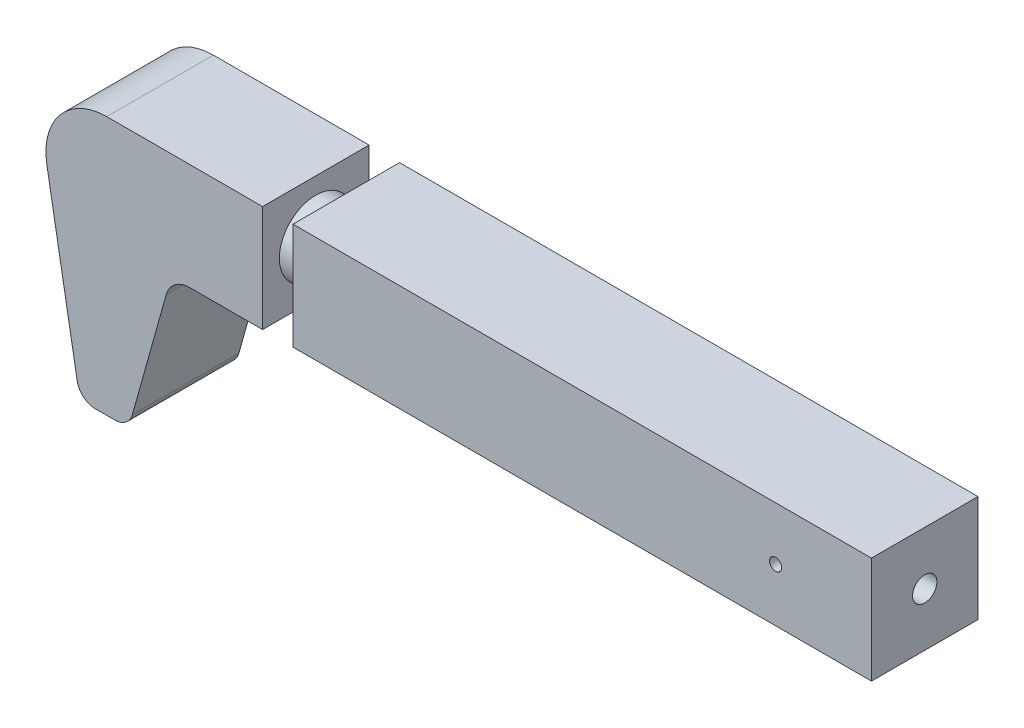
ISO-10303-21;
HEADER;
FILE_DESCRIPTION(('STEP AP214'),'2;1');
FILE_NAME('part.step','',(''),(''),'','','');
FILE_SCHEMA(('AUTOMOTIVE_DESIGN { 1 0 10303 214 1 1 1 1 }'));
ENDSEC;
DATA;
#1=APPLICATION_CONTEXT('core data for automotive mechanical design processes');
#2=APPLICATION_PROTOCOL_DEFINITION('international standard','automotive_design',2000,#1);
#3=PRODUCT_CONTEXT('',#1,'mechanical');
#4=PRODUCT('Part','Part','',(#3));
#5=PRODUCT_RELATED_PRODUCT_CATEGORY('part','',(#4));
#6=PRODUCT_DEFINITION_FORMATION('','',#4);
#7=PRODUCT_DEFINITION_CONTEXT('part definition',#1,'design');
#8=PRODUCT_DEFINITION('design','',#6,#7);
#9=PRODUCT_DEFINITION_SHAPE('','',#8);
#10=(LENGTH_UNIT() NAMED_UNIT(*) SI_UNIT(.MILLI.,.METRE.));
#11=(NAMED_UNIT(*) PLANE_ANGLE_UNIT() SI_UNIT($,.RADIAN.));
#12=(NAMED_UNIT(*) SI_UNIT($,.STERADIAN.) SOLID_ANGLE_UNIT());
#13=UNCERTAINTY_MEASURE_WITH_UNIT(LENGTH_MEASURE(1.E-05),#10,'distance_accuracy_value','');
#14=(GEOMETRIC_REPRESENTATION_CONTEXT(3) GLOBAL_UNCERTAINTY_ASSIGNED_CONTEXT((#13)) GLOBAL_UNIT_ASSIGNED_CONTEXT((#10,
#11,#12)) REPRESENTATION_CONTEXT('',''));
#15=CARTESIAN_POINT('',(0.,0.,0.));
#16=DIRECTION('',(0.,0.,1.));
#17=DIRECTION('',(1.,0.,0.));
#18=AXIS2_PLACEMENT_3D('',#15,#16,#17);
#19=CARTESIAN_POINT('',(100.,17.5,17.5));
#20=DIRECTION('',(0.,0.,-1.));
#21=DIRECTION('',(-1.,0.,0.));
#22=AXIS2_PLACEMENT_3D('',#19,#20,#21);
#23=PLANE('',#22);
#24=CARTESIAN_POINT('',(84.25,8.75000000000001,17.5));
#25=DIRECTION('',(0.,0.,-1.));
#26=DIRECTION('',(-1.,0.,0.));
#27=AXIS2_PLACEMENT_3D('',#24,#25,#26);
#28=CIRCLE('',#27,0.999999999999998);
#29=CARTESIAN_POINT('',(83.25,8.75000000000001,17.5));
#30=VERTEX_POINT('',#29);
#31=EDGE_CURVE('E190',#30,#30,#28,.T.);
#32=ORIENTED_EDGE('',*,*,#31,.T.);
#33=EDGE_LOOP('',(#32));
#34=FACE_BOUND('',#33,.T.);
#35=DIRECTION('',(0.,-1.,0.));
#36=VECTOR('',#35,1.);
#37=CARTESIAN_POINT('',(5.,17.5,17.5));
#38=LINE('',#37,#36);
#39=CARTESIAN_POINT('',(5.,17.5,17.5));
#40=VERTEX_POINT('',#39);
#41=CARTESIAN_POINT('',(5.,0.,17.5));
#42=VERTEX_POINT('',#41);
#43=EDGE_CURVE('E197',#40,#42,#38,.T.);
#44=ORIENTED_EDGE('',*,*,#43,.T.);
#45=DIRECTION('',(-1.,0.,0.));
#46=VECTOR('',#45,1.);
#47=CARTESIAN_POINT('',(100.,0.,17.5));
#48=LINE('',#47,#46);
#49=CARTESIAN_POINT('',(100.,0.,17.5));
#50=VERTEX_POINT('',#49);
#51=EDGE_CURVE('E49',#50,#42,#48,.T.);
#52=ORIENTED_EDGE('',*,*,#51,.F.);
#53=DIRECTION('',(0.,-1.,0.));
#54=VECTOR('',#53,1.);
#55=CARTESIAN_POINT('',(100.,17.5,17.5));
#56=LINE('',#55,#54);
#57=CARTESIAN_POINT('',(100.,17.5,17.5));
#58=VERTEX_POINT('',#57);
#59=EDGE_CURVE('E200',#58,#50,#56,.T.);
#60=ORIENTED_EDGE('',*,*,#59,.F.);
#61=DIRECTION('',(-1.,0.,0.));
#62=VECTOR('',#61,1.);
#63=CARTESIAN_POINT('',(100.,17.5,17.5));
#64=LINE('',#63,#62);
#65=EDGE_CURVE('E206',#58,#40,#64,.T.);
#66=ORIENTED_EDGE('',*,*,#65,.T.);
#67=EDGE_LOOP('',(#44,#52,#60,#66));
#68=FACE_BOUND('',#67,.T.);
#69=ADVANCED_FACE('F35',(#34,#68),#23,.F.);
#70=CARTESIAN_POINT('',(100.,0.,17.5));
#71=DIRECTION('',(0.,1.,0.));
#72=DIRECTION('',(0.,0.,1.));
#73=AXIS2_PLACEMENT_3D('',#70,#71,#72);
#74=PLANE('',#73);
#75=DIRECTION('',(0.,0.,-1.));
#76=VECTOR('',#75,1.);
#77=CARTESIAN_POINT('',(5.,0.,17.5));
#78=LINE('',#77,#76);
#79=CARTESIAN_POINT('',(5.,0.,0.));
#80=VERTEX_POINT('',#79);
#81=EDGE_CURVE('E209',#42,#80,#78,.T.);
#82=ORIENTED_EDGE('',*,*,#81,.T.);
#83=DIRECTION('',(-1.,0.,0.));
#84=VECTOR('',#83,1.);
#85=CARTESIAN_POINT('',(100.,0.,0.));
#86=LINE('',#85,#84);
#87=CARTESIAN_POINT('',(100.,0.,0.));
#88=VERTEX_POINT('',#87);
#89=EDGE_CURVE('E216',#88,#80,#86,.T.);
#90=ORIENTED_EDGE('',*,*,#89,.F.);
#91=DIRECTION('',(0.,0.,-1.));
#92=VECTOR('',#91,1.);
#93=CARTESIAN_POINT('',(100.,0.,17.5));
#94=LINE('',#93,#92);
#95=EDGE_CURVE('E90',#50,#88,#94,.T.);
#96=ORIENTED_EDGE('',*,*,#95,.F.);
#97=ORIENTED_EDGE('',*,*,#51,.T.);
#98=EDGE_LOOP('',(#82,#90,#96,#97));
#99=FACE_BOUND('',#98,.T.);
#100=ADVANCED_FACE('F246',(#99),#74,.F.);
#101=CARTESIAN_POINT('',(100.,17.5,0.));
#102=DIRECTION('',(0.,0.,1.));
#103=DIRECTION('',(1.,0.,0.));
#104=AXIS2_PLACEMENT_3D('',#101,#102,#103);
#105=PLANE('',#104);
#106=CARTESIAN_POINT('',(84.25,8.75000000000001,0.));
#107=DIRECTION('',(0.,0.,-1.));
#108=DIRECTION('',(-1.,0.,0.));
#109=AXIS2_PLACEMENT_3D('',#106,#107,#108);
#110=CIRCLE('',#109,0.999999999999998);
#111=CARTESIAN_POINT('',(83.25,8.75000000000001,0.));
#112=VERTEX_POINT('',#111);
#113=EDGE_CURVE('E181',#112,#112,#110,.T.);
#114=ORIENTED_EDGE('',*,*,#113,.F.);
#115=EDGE_LOOP('',(#114));
#116=FACE_BOUND('',#115,.T.);
#117=DIRECTION('',(0.,1.,0.));
#118=VECTOR('',#117,1.);
#119=CARTESIAN_POINT('',(5.,17.5,0.));
#120=LINE('',#119,#118);
#121=CARTESIAN_POINT('',(5.,17.5,0.));
#122=VERTEX_POINT('',#121);
#123=EDGE_CURVE('E76',#80,#122,#120,.T.);
#124=ORIENTED_EDGE('',*,*,#123,.T.);
#125=DIRECTION('',(-1.,0.,0.));
#126=VECTOR('',#125,1.);
#127=CARTESIAN_POINT('',(100.,17.5,0.));
#128=LINE('',#127,#126);
#129=CARTESIAN_POINT('',(100.,17.5,0.));
#130=VERTEX_POINT('',#129);
#131=EDGE_CURVE('E214',#130,#122,#128,.T.);
#132=ORIENTED_EDGE('',*,*,#131,.F.);
#133=DIRECTION('',(0.,1.,0.));
#134=VECTOR('',#133,1.);
#135=CARTESIAN_POINT('',(100.,17.5,0.));
#136=LINE('',#135,#134);
#137=EDGE_CURVE('E203',#88,#130,#136,.T.);
#138=ORIENTED_EDGE('',*,*,#137,.F.);
#139=ORIENTED_EDGE('',*,*,#89,.T.);
#140=EDGE_LOOP('',(#124,#132,#138,#139));
#141=FACE_BOUND('',#140,.T.);
#142=ADVANCED_FACE('F251',(#116,#141),#105,.F.);
#143=CARTESIAN_POINT('',(100.,17.5,17.5));
#144=DIRECTION('',(0.,-1.,0.));
#145=DIRECTION('',(0.,0.,-1.));
#146=AXIS2_PLACEMENT_3D('',#143,#144,#145);
#147=PLANE('',#146);
#148=DIRECTION('',(0.,0.,1.));
#149=VECTOR('',#148,1.);
#150=CARTESIAN_POINT('',(5.,17.5,17.5));
#151=LINE('',#150,#149);
#152=EDGE_CURVE('E82',#122,#40,#151,.T.);
#153=ORIENTED_EDGE('',*,*,#152,.T.);
#154=ORIENTED_EDGE('',*,*,#65,.F.);
#155=DIRECTION('',(0.,0.,1.));
#156=VECTOR('',#155,1.);
#157=CARTESIAN_POINT('',(100.,17.5,17.5));
#158=LINE('',#157,#156);
#159=EDGE_CURVE('E58',#130,#58,#158,.T.);
#160=ORIENTED_EDGE('',*,*,#159,.F.);
#161=ORIENTED_EDGE('',*,*,#131,.T.);
#162=EDGE_LOOP('',(#153,#154,#160,#161));
#163=FACE_BOUND('',#162,.T.);
#164=ADVANCED_FACE('F261',(#163),#147,.F.);
#165=CARTESIAN_POINT('',(100.,0.,0.));
#166=DIRECTION('',(1.,0.,0.));
#167=DIRECTION('',(0.,0.,-1.));
#168=AXIS2_PLACEMENT_3D('',#165,#166,#167);
#169=PLANE('',#168);
#170=CARTESIAN_POINT('',(100.,8.75,8.75));
#171=DIRECTION('',(1.,0.,0.));
#172=DIRECTION('',(0.,1.,0.));
#173=AXIS2_PLACEMENT_3D('',#170,#171,#172);
#174=CIRCLE('',#173,2.);
#175=CARTESIAN_POINT('',(100.,10.75,8.75));
#176=VERTEX_POINT('',#175);
#177=EDGE_CURVE('E193',#176,#176,#174,.T.);
#178=ORIENTED_EDGE('',*,*,#177,.F.);
#179=EDGE_LOOP('',(#178));
#180=FACE_BOUND('',#179,.T.);
#181=ORIENTED_EDGE('',*,*,#59,.T.);
#182=ORIENTED_EDGE('',*,*,#95,.T.);
#183=ORIENTED_EDGE('',*,*,#137,.T.);
#184=ORIENTED_EDGE('',*,*,#159,.T.);
#185=EDGE_LOOP('',(#181,#182,#183,#184));
#186=FACE_BOUND('',#185,.T.);
#187=ADVANCED_FACE('F259',(#180,#186),#169,.T.);
#188=CARTESIAN_POINT('',(5.,0.,0.));
#189=DIRECTION('',(1.,0.,0.));
#190=DIRECTION('',(0.,0.,-1.));
#191=AXIS2_PLACEMENT_3D('',#188,#189,#190);
#192=PLANE('',#191);
#193=CARTESIAN_POINT('',(5.,8.75,8.75));
#194=DIRECTION('',(-1.,0.,0.));
#195=DIRECTION('',(0.,0.,1.));
#196=AXIS2_PLACEMENT_3D('',#193,#194,#195);
#197=CIRCLE('',#196,6.);
#198=CARTESIAN_POINT('',(5.,8.75,14.75));
#199=VERTEX_POINT('',#198);
#200=EDGE_CURVE('E11',#199,#199,#197,.T.);
#201=ORIENTED_EDGE('',*,*,#200,.F.);
#202=EDGE_LOOP('',(#201));
#203=FACE_BOUND('',#202,.T.);
#204=ORIENTED_EDGE('',*,*,#43,.F.);
#205=ORIENTED_EDGE('',*,*,#152,.F.);
#206=ORIENTED_EDGE('',*,*,#123,.F.);
#207=ORIENTED_EDGE('',*,*,#81,.F.);
#208=EDGE_LOOP('',(#204,#205,#206,#207));
#209=FACE_BOUND('',#208,.T.);
#210=ADVANCED_FACE('F243',(#203,#209),#192,.F.);
#211=CARTESIAN_POINT('',(50.,8.74999999999999,8.75));
#212=DIRECTION('',(1.,0.,0.));
#213=DIRECTION('',(0.,1.,0.));
#214=AXIS2_PLACEMENT_3D('',#211,#212,#213);
#215=CYLINDRICAL_SURFACE('',#214,2.);
#216=CARTESIAN_POINT('',(83.25,8.75000000000001,10.75));
#217=CARTESIAN_POINT('',(83.2500033023195,8.69742803704703,10.7499971340415));
#218=CARTESIAN_POINT('',(83.2541700731217,8.64479340030198,10.7479049101952));
#219=CARTESIAN_POINT('',(83.2706528803409,8.54107976473159,10.739741560374));
#220=CARTESIAN_POINT('',(83.2829843929977,8.49000391328651,10.7336628782898));
#221=CARTESIAN_POINT('',(83.3151938086168,8.39106645511944,10.7181627940331));
#222=CARTESIAN_POINT('',(83.335042384248,8.34319319706083,10.7087543917752));
#223=CARTESIAN_POINT('',(83.3815706213649,8.25152738319345,10.6874577651578));
#224=CARTESIAN_POINT('',(83.4082497442489,8.20773450600996,10.6755697363353));
#225=CARTESIAN_POINT('',(83.4695172494853,8.12249218223809,10.6495625825806));
#226=CARTESIAN_POINT('',(83.5044864792396,8.0813447888779,10.6353519912754));
#227=CARTESIAN_POINT('',(83.5805214792471,8.00522055513303,10.6065997024675));
#228=CARTESIAN_POINT('',(83.6215918517725,7.97024841689325,10.5920577620904));
#229=CARTESIAN_POINT('',(83.7124833495234,7.90474799954973,10.5629895119735));
#230=CARTESIAN_POINT('',(83.7627360983459,7.87477466444837,10.5485518697013));
#231=CARTESIAN_POINT('',(83.8683673359862,7.82383177310932,10.5228597877232));
#232=CARTESIAN_POINT('',(83.9237421287228,7.80285578503368,10.5116030760699));
#233=CARTESIAN_POINT('',(84.0346651054219,7.77186755781142,10.4945786703781));
#234=CARTESIAN_POINT('',(84.0900044520674,7.76127414291957,10.4885227158371));
#235=CARTESIAN_POINT('',(84.2019788377795,7.74957300669117,10.4818188994853));
#236=CARTESIAN_POINT('',(84.2586125408712,7.74845591162694,10.4811656934329));
#237=CARTESIAN_POINT('',(84.3642860243154,7.75531271282772,10.4851093025725));
#238=CARTESIAN_POINT('',(84.4134240312231,7.7622154404632,10.4890876366201));
#239=CARTESIAN_POINT('',(84.509721909373,7.78306015094308,10.5007622873385));
#240=CARTESIAN_POINT('',(84.5568811453053,7.79700437610236,10.5084597883178));
#241=CARTESIAN_POINT('',(84.6492291325657,7.83179021961401,10.5268747641274));
#242=CARTESIAN_POINT('',(84.6943463987858,7.85278493288402,10.53765840664));
#243=CARTESIAN_POINT('',(84.78063429259,7.90095831233201,10.561034042814));
#244=CARTESIAN_POINT('',(84.8218031356001,7.92813975618755,10.5736268478019));
#245=CARTESIAN_POINT('',(84.9045212527432,7.99193394508723,10.6011315790329));
#246=CARTESIAN_POINT('',(84.9454568735762,8.02930554163073,10.6161351023675));
#247=CARTESIAN_POINT('',(85.0207354185909,8.11044442125864,10.6454762330041));
#248=CARTESIAN_POINT('',(85.0550751920339,8.15421474342574,10.659813519588));
#249=CARTESIAN_POINT('',(85.1176856610297,8.24948349416818,10.6870198728296));
#250=CARTESIAN_POINT('',(85.1456004724457,8.30124640840061,10.6997898416201));
#251=CARTESIAN_POINT('',(85.192097029043,8.40953378451122,10.7215788112124));
#252=CARTESIAN_POINT('',(85.2106861850152,8.46605442373474,10.7306007894355));
#253=CARTESIAN_POINT('',(85.2364754037167,8.57723350833932,10.7432433374144));
#254=CARTESIAN_POINT('',(85.2444912357468,8.63165846945169,10.7472493830131));
#255=CARTESIAN_POINT('',(85.2514647311345,8.74122040005066,10.750730134591));
#256=CARTESIAN_POINT('',(85.2504266856395,8.79635701986992,10.7502069872131));
#257=CARTESIAN_POINT('',(85.2397933115812,8.90123297198601,10.7449119225344));
#258=CARTESIAN_POINT('',(85.23086746727,8.95105940804997,10.7404724568819));
#259=CARTESIAN_POINT('',(85.2057619281049,9.04840689230193,10.7282217131482));
#260=CARTESIAN_POINT('',(85.1895814335466,9.09592768569101,10.7204100633433));
#261=CARTESIAN_POINT('',(85.1500015335668,9.18888860844968,10.7018425141367));
#262=CARTESIAN_POINT('',(85.1264089498832,9.23423039700616,10.6910088176994));
#263=CARTESIAN_POINT('',(85.072892464354,9.32046136169893,10.6674397431711));
#264=CARTESIAN_POINT('',(85.0429658654066,9.36134862977529,10.6547035556578));
#265=CARTESIAN_POINT('',(84.9742395746671,9.44176768929066,10.6270822133746));
#266=CARTESIAN_POINT('',(84.9348571315465,9.48077207782464,10.6121088484844));
#267=CARTESIAN_POINT('',(84.8500748487307,9.55185632111325,10.5826239160387));
#268=CARTESIAN_POINT('',(84.8046708811836,9.58393138569085,10.5681126738153));
#269=CARTESIAN_POINT('',(84.7063563457997,9.64170791449771,10.5405119222607));
#270=CARTESIAN_POINT('',(84.6531887337914,9.66702549587865,10.5275252966347));
#271=CARTESIAN_POINT('',(84.5424899323075,9.70808282601382,10.5057407236813));
#272=CARTESIAN_POINT('',(84.4849644734988,9.72383491588758,10.4969373824062));
#273=CARTESIAN_POINT('',(84.3730897771385,9.74386168744969,10.4856150100867));
#274=CARTESIAN_POINT('',(84.318965746571,9.74909299640088,10.4825738346049));
#275=CARTESIAN_POINT('',(84.2105529328293,9.7506891543808,10.4816535464617));
#276=CARTESIAN_POINT('',(84.1562642312606,9.74705784662441,10.4837721962755));
#277=CARTESIAN_POINT('',(84.054516498468,9.73192612559227,10.4923786205002));
#278=CARTESIAN_POINT('',(84.0068995298556,9.72120831434281,10.4984309448239));
#279=CARTESIAN_POINT('',(83.9141918805753,9.69317535822466,10.5137101618792));
#280=CARTESIAN_POINT('',(83.869102017908,9.67585809115982,10.5229380756968));
#281=CARTESIAN_POINT('',(83.7793751490134,9.63381574530069,10.5442853036453));
#282=CARTESIAN_POINT('',(83.7349720981703,9.60867113781647,10.5565572239619));
#283=CARTESIAN_POINT('',(83.6507254638194,9.55215097163664,10.5823533163459));
#284=CARTESIAN_POINT('',(83.6108842694815,9.52077217123865,10.5958781379452));
#285=CARTESIAN_POINT('',(83.5318580176424,9.44820332666464,10.6246232315931));
#286=CARTESIAN_POINT('',(83.4933408976381,9.40628442301017,10.6398498331147));
#287=CARTESIAN_POINT('',(83.4237370165764,9.31615480622029,10.6687775225509));
#288=CARTESIAN_POINT('',(83.3926542605737,9.2679407232568,10.6824777860804));
#289=CARTESIAN_POINT('',(83.3387636372378,9.16593159681996,10.706980095851));
#290=CARTESIAN_POINT('',(83.3160158305886,9.11209950393463,10.7177609656291));
#291=CARTESIAN_POINT('',(83.280191832081,9.0007421012942,10.7350134136347));
#292=CARTESIAN_POINT('',(83.2670881531704,8.94322779962318,10.7414972337293));
#293=CARTESIAN_POINT('',(83.2561025889242,8.86260194648339,10.7469546190966));
#294=CARTESIAN_POINT('',(83.2538173591364,8.84016187943951,10.748093653392));
#295=CARTESIAN_POINT('',(83.2507653344832,8.79515173180717,10.7496169697786));
#296=CARTESIAN_POINT('',(83.2499985815288,8.77258164764739,10.7500012310376));
#297=CARTESIAN_POINT('',(83.25,8.75000000000001,10.75));
#298=B_SPLINE_CURVE_WITH_KNOTS('',3,(#216,#217,#218,#219,#220,#221,#222,#223,#224,#225,#226,
#227,#228,#229,#230,#231,#232,#233,#234,#235,#236,#237,#238,#239,#240,#241,#242,#243,#244,#245,
#246,#247,#248,#249,#250,#251,#252,#253,#254,#255,#256,#257,#258,#259,#260,#261,#262,#263,#264,
#265,#266,#267,#268,#269,#270,#271,#272,#273,#274,#275,#276,#277,#278,#279,#280,#281,#282,#283,
#284,#285,#286,#287,#288,#289,#290,#291,#292,#293,#294,#295,#296,#297),.UNSPECIFIED.,.T.,.F.,(4,
2,2,2,2,2,2,2,2,2,2,2,2,2,2,2,2,2,2,2,2,2,2,2,2,2,2,2,2,2,2,2,2,2,2,2,2,2,2,2,4),(0.,
0.157624257420293,0.315548149709198,0.472862155492299,0.630163760581567,0.796981758718093,
0.963926237654037,1.14381726430753,1.32357947898281,1.49258012140231,1.66141357329021,
1.8100571240932,1.95874803925678,2.11090240168487,2.26312521260221,2.43464941333878,
2.60625534598687,2.7858302221444,2.96526216912279,3.12983290471345,3.29432564511475,
3.44606906506121,3.5978292163093,3.75392856027897,3.91009450748338,4.08159610644415,
4.25321588615431,4.43314682159674,4.61284511940778,4.77529307498375,4.93767059860005,
5.08457930244179,5.23153528783677,5.38836456775613,5.54527561138958,5.72125242752498,
5.89732383376571,6.07464013662924,6.25144908624929,6.31915280137696,6.38685838514845),.UNSPECIFIED.);
#299=CARTESIAN_POINT('',(83.25,8.75000000000001,10.75));
#300=VERTEX_POINT('',#299);
#301=EDGE_CURVE('E38',#300,#300,#298,.T.);
#302=ORIENTED_EDGE('',*,*,#301,.T.);
#303=EDGE_LOOP('',(#302));
#304=FACE_BOUND('',#303,.T.);
#305=CARTESIAN_POINT('',(83.25,8.75000000000001,6.75));
#306=CARTESIAN_POINT('',(83.2500033023195,8.802571962953,6.75000286595849));
#307=CARTESIAN_POINT('',(83.2541700731217,8.85520659969804,6.75209508980482));
#308=CARTESIAN_POINT('',(83.2706528803409,8.95892023526844,6.76025843962604));
#309=CARTESIAN_POINT('',(83.2829843929977,9.00999608671352,6.76633712171017));
#310=CARTESIAN_POINT('',(83.3151938086168,9.10893354488059,6.78183720596689));
#311=CARTESIAN_POINT('',(83.335042384248,9.15680680293919,6.7912456082248));
#312=CARTESIAN_POINT('',(83.3815706213649,9.24847261680658,6.81254223484222));
#313=CARTESIAN_POINT('',(83.4082497442489,9.29226549399007,6.82443026366471));
#314=CARTESIAN_POINT('',(83.4695172494853,9.37750781776194,6.85043741741944));
#315=CARTESIAN_POINT('',(83.5044864792396,9.41865521112213,6.86464800872465));
#316=CARTESIAN_POINT('',(83.5805214792471,9.49477944486699,6.89340029753256));
#317=CARTESIAN_POINT('',(83.6215918517725,9.52975158310678,6.90794223790966));
#318=CARTESIAN_POINT('',(83.7124833495234,9.59525200045029,6.93701048802654));
#319=CARTESIAN_POINT('',(83.7627360983459,9.62522533555165,6.95144813029869));
#320=CARTESIAN_POINT('',(83.8683673359862,9.67616822689071,6.9771402122768));
#321=CARTESIAN_POINT('',(83.9237421287228,9.69714421496635,6.98839692393011));
#322=CARTESIAN_POINT('',(84.0346651054219,9.7281324421886,7.00542132962192));
#323=CARTESIAN_POINT('',(84.0900044520674,9.73872585708045,7.01147728416287));
#324=CARTESIAN_POINT('',(84.2019788377795,9.75042699330886,7.01818110051473));
#325=CARTESIAN_POINT('',(84.2586125408712,9.75154408837308,7.01883430656713));
#326=CARTESIAN_POINT('',(84.3642860243154,9.7446872871723,7.01489069742752));
#327=CARTESIAN_POINT('',(84.4134240312231,9.73778455953683,7.01091236337987));
#328=CARTESIAN_POINT('',(84.509721909373,9.71693984905694,6.99923771266151));
#329=CARTESIAN_POINT('',(84.5568811453053,9.70299562389767,6.99154021168225));
#330=CARTESIAN_POINT('',(84.6492291325657,9.66820978038602,6.9731252358726));
#331=CARTESIAN_POINT('',(84.6943463987858,9.64721506711601,6.96234159336002));
#332=CARTESIAN_POINT('',(84.78063429259,9.59904168766801,6.93896595718597));
#333=CARTESIAN_POINT('',(84.8218031356001,9.57186024381248,6.9263731521981));
#334=CARTESIAN_POINT('',(84.9045212527432,9.5080660549128,6.89886842096715));
#335=CARTESIAN_POINT('',(84.9454568735762,9.47069445836929,6.88386489763254));
#336=CARTESIAN_POINT('',(85.0207354185909,9.38955557874137,6.85452376699593));
#337=CARTESIAN_POINT('',(85.0550751920339,9.34578525657429,6.84018648041199));
#338=CARTESIAN_POINT('',(85.1176856610297,9.25051650583186,6.81298012717037));
#339=CARTESIAN_POINT('',(85.1456004724457,9.19875359159942,6.80021015837993));
#340=CARTESIAN_POINT('',(85.192097029043,9.09046621548881,6.77842118878758));
#341=CARTESIAN_POINT('',(85.2106861850152,9.03394557626528,6.76939921056448));
#342=CARTESIAN_POINT('',(85.2364754037167,8.92276649166071,6.75675666258564));
#343=CARTESIAN_POINT('',(85.2444912357468,8.86834153054833,6.75275061698688));
#344=CARTESIAN_POINT('',(85.2514647311345,8.75877959994936,6.74926986540898));
#345=CARTESIAN_POINT('',(85.2504266856395,8.70364298013011,6.74979301278688));
#346=CARTESIAN_POINT('',(85.2397933115812,8.59876702801402,6.75508807746559));
#347=CARTESIAN_POINT('',(85.23086746727,8.54894059195006,6.7595275431181));
#348=CARTESIAN_POINT('',(85.2057619281049,8.45159310769809,6.77177828685181));
#349=CARTESIAN_POINT('',(85.1895814335467,8.40407231430901,6.77958993665667));
#350=CARTESIAN_POINT('',(85.1500015335668,8.31111139155035,6.7981574858633));
#351=CARTESIAN_POINT('',(85.1264089498832,8.26576960299386,6.8089911823006));
#352=CARTESIAN_POINT('',(85.072892464354,8.17953863830109,6.83256025682891));
#353=CARTESIAN_POINT('',(85.0429658654066,8.13865137022473,6.84529644434215));
#354=CARTESIAN_POINT('',(84.9742395746671,8.05823231070936,6.87291778662535));
#355=CARTESIAN_POINT('',(84.9348571315464,8.01922792217538,6.88789115151558));
#356=CARTESIAN_POINT('',(84.8500748487307,7.94814367888678,6.91737608396125));
#357=CARTESIAN_POINT('',(84.8046708811836,7.91606861430917,6.93188732618473));
#358=CARTESIAN_POINT('',(84.7063563457997,7.85829208550232,6.95948807773931));
#359=CARTESIAN_POINT('',(84.6531887337914,7.83297450412138,6.97247470336527));
#360=CARTESIAN_POINT('',(84.5424899323075,7.79191717398621,6.99425927631873));
#361=CARTESIAN_POINT('',(84.4849644734988,7.77616508411245,7.00306261759381));
#362=CARTESIAN_POINT('',(84.3730897771386,7.75613831255034,7.01438498991332));
#363=CARTESIAN_POINT('',(84.318965746571,7.75090700359915,7.01742616539508));
#364=CARTESIAN_POINT('',(84.2105529328293,7.74931084561923,7.01834645353824));
#365=CARTESIAN_POINT('',(84.1562642312606,7.75294215337562,7.01622780372447));
#366=CARTESIAN_POINT('',(84.054516498468,7.76807387440775,7.00762137949974));
#367=CARTESIAN_POINT('',(84.0068995298556,7.77879168565721,7.00156905517606));
#368=CARTESIAN_POINT('',(83.9141918805753,7.80682464177537,6.98628983812082));
#369=CARTESIAN_POINT('',(83.869102017908,7.8241419088402,6.97706192430324));
#370=CARTESIAN_POINT('',(83.7793751490134,7.86618425469934,6.95571469635471));
#371=CARTESIAN_POINT('',(83.7349720981703,7.89132886218357,6.94344277603808));
#372=CARTESIAN_POINT('',(83.6507254638194,7.94784902836339,6.91764668365409));
#373=CARTESIAN_POINT('',(83.6108842694815,7.97922782876138,6.90412186205477));
#374=CARTESIAN_POINT('',(83.5318580176424,8.05179667333538,6.87537676840686));
#375=CARTESIAN_POINT('',(83.4933408976381,8.09371557698985,6.86015016688531));
#376=CARTESIAN_POINT('',(83.4237370165764,8.18384519377974,6.83122247744912));
#377=CARTESIAN_POINT('',(83.3926542605737,8.23205927674323,6.8175222139196));
#378=CARTESIAN_POINT('',(83.3387636372378,8.33406840318007,6.79301990414897));
#379=CARTESIAN_POINT('',(83.3160158305886,8.3879004960654,6.78223903437091));
#380=CARTESIAN_POINT('',(83.280191832081,8.49925789870582,6.76498658636534));
#381=CARTESIAN_POINT('',(83.2670881531704,8.55677220037685,6.75850276627068));
#382=CARTESIAN_POINT('',(83.2561025889242,8.63739805351663,6.75304538090337));
#383=CARTESIAN_POINT('',(83.2538173591364,8.65983812056052,6.75190634660798));
#384=CARTESIAN_POINT('',(83.2507653344832,8.70484826819286,6.75038303022135));
#385=CARTESIAN_POINT('',(83.2499985815288,8.72741835235263,6.74999876896237));
#386=CARTESIAN_POINT('',(83.25,8.75000000000001,6.75));
#387=B_SPLINE_CURVE_WITH_KNOTS('',3,(#305,#306,#307,#308,#309,#310,#311,#312,#313,#314,#315,
#316,#317,#318,#319,#320,#321,#322,#323,#324,#325,#326,#327,#328,#329,#330,#331,#332,#333,#334,
#335,#336,#337,#338,#339,#340,#341,#342,#343,#344,#345,#346,#347,#348,#349,#350,#351,#352,#353,
#354,#355,#356,#357,#358,#359,#360,#361,#362,#363,#364,#365,#366,#367,#368,#369,#370,#371,#372,
#373,#374,#375,#376,#377,#378,#379,#380,#381,#382,#383,#384,#385,#386),.UNSPECIFIED.,.T.,.F.,(4,
2,2,2,2,2,2,2,2,2,2,2,2,2,2,2,2,2,2,2,2,2,2,2,2,2,2,2,2,2,2,2,2,2,2,2,2,2,2,2,4),(0.,
0.157624257420293,0.315548149709198,0.4728621554923,0.630163760581568,0.796981758718095,
0.963926237654039,1.14381726430754,1.32357947898281,1.4925801214023,1.66141357329021,
1.8100571240932,1.95874803925678,2.11090240168487,2.26312521260222,2.4346494133388,
2.60625534598686,2.7858302221444,2.9652621691228,3.12983290471346,3.29432564511476,
3.44606906506121,3.59782921630931,3.75392856027899,3.91009450748338,4.08159610644418,
4.25321588615431,4.43314682159673,4.61284511940776,4.77529307498373,4.93767059860004,
5.08457930244179,5.23153528783677,5.38836456775616,5.54527561138958,5.72125242752497,
5.89732383376571,6.07464013662924,6.25144908624929,6.31915280137696,6.38685838514845),.UNSPECIFIED.);
#388=CARTESIAN_POINT('',(83.25,8.75000000000001,6.75));
#389=VERTEX_POINT('',#388);
#390=EDGE_CURVE('E189',#389,#389,#387,.T.);
#391=ORIENTED_EDGE('',*,*,#390,.T.);
#392=EDGE_LOOP('',(#391));
#393=FACE_BOUND('',#392,.T.);
#394=CARTESIAN_POINT('',(50.,8.74999999999999,8.75));
#395=DIRECTION('',(1.,0.,0.));
#396=DIRECTION('',(0.,1.,0.));
#397=AXIS2_PLACEMENT_3D('',#394,#395,#396);
#398=CIRCLE('',#397,2.);
#399=CARTESIAN_POINT('',(50.,10.75,8.75));
#400=VERTEX_POINT('',#399);
#401=EDGE_CURVE('E194',#400,#400,#398,.T.);
#402=ORIENTED_EDGE('',*,*,#401,.F.);
#403=EDGE_LOOP('',(#402));
#404=FACE_BOUND('',#403,.T.);
#405=ORIENTED_EDGE('',*,*,#177,.T.);
#406=EDGE_LOOP('',(#405));
#407=FACE_BOUND('',#406,.T.);
#408=ADVANCED_FACE('F222',(#304,#393,#404,#407),#215,.F.);
#409=CARTESIAN_POINT('',(50.,8.74999999999999,8.75));
#410=DIRECTION('',(1.,0.,0.));
#411=DIRECTION('',(0.,1.,0.));
#412=AXIS2_PLACEMENT_3D('',#409,#410,#411);
#413=PLANE('',#412);
#414=ORIENTED_EDGE('',*,*,#401,.T.);
#415=EDGE_LOOP('',(#414));
#416=FACE_BOUND('',#415,.T.);
#417=ADVANCED_FACE('F234',(#416),#413,.T.);
#418=CARTESIAN_POINT('',(84.25,8.75000000000001,50.));
#419=DIRECTION('',(0.,0.,-1.));
#420=DIRECTION('',(-1.,0.,0.));
#421=AXIS2_PLACEMENT_3D('',#418,#419,#420);
#422=CYLINDRICAL_SURFACE('',#421,0.999999999999998);
#423=ORIENTED_EDGE('',*,*,#113,.T.);
#424=EDGE_LOOP('',(#423));
#425=FACE_BOUND('',#424,.T.);
#426=ORIENTED_EDGE('',*,*,#390,.F.);
#427=EDGE_LOOP('',(#426));
#428=FACE_BOUND('',#427,.T.);
#429=ADVANCED_FACE('F231',(#425,#428),#422,.F.);
#430=ORIENTED_EDGE('',*,*,#301,.F.);
#431=EDGE_LOOP('',(#430));
#432=FACE_BOUND('',#431,.T.);
#433=ORIENTED_EDGE('',*,*,#31,.F.);
#434=EDGE_LOOP('',(#433));
#435=FACE_BOUND('',#434,.T.);
#436=ADVANCED_FACE('F226',(#432,#435),#422,.F.);
#437=CARTESIAN_POINT('',(0.,8.75,8.75));
#438=DIRECTION('',(1.,0.,0.));
#439=DIRECTION('',(0.,0.,-1.));
#440=AXIS2_PLACEMENT_3D('',#437,#438,#439);
#441=CYLINDRICAL_SURFACE('',#440,6.);
#442=CARTESIAN_POINT('',(0.,8.75,8.75));
#443=DIRECTION('',(-1.,0.,0.));
#444=DIRECTION('',(0.,0.,1.));
#445=AXIS2_PLACEMENT_3D('',#442,#443,#444);
#446=CIRCLE('',#445,6.);
#447=CARTESIAN_POINT('',(0.,8.75,14.75));
#448=VERTEX_POINT('',#447);
#449=EDGE_CURVE('E178',#448,#448,#446,.T.);
#450=ORIENTED_EDGE('',*,*,#449,.F.);
#451=EDGE_LOOP('',(#450));
#452=FACE_BOUND('',#451,.T.);
#453=ORIENTED_EDGE('',*,*,#200,.T.);
#454=EDGE_LOOP('',(#453));
#455=FACE_BOUND('',#454,.T.);
#456=ADVANCED_FACE('F230',(#452,#455),#441,.T.);
#457=CARTESIAN_POINT('',(0.,17.5,17.5));
#458=DIRECTION('',(-1.,0.,0.));
#459=DIRECTION('',(0.,-1.,0.));
#460=AXIS2_PLACEMENT_3D('',#457,#458,#459);
#461=PLANE('',#460);
#462=ORIENTED_EDGE('',*,*,#449,.T.);
#463=EDGE_LOOP('',(#462));
#464=FACE_BOUND('',#463,.T.);
#465=DIRECTION('',(0.,1.,0.));
#466=VECTOR('',#465,1.);
#467=CARTESIAN_POINT('',(0.,17.5,0.));
#468=LINE('',#467,#466);
#469=CARTESIAN_POINT('',(0.,0.,0.));
#470=VERTEX_POINT('',#469);
#471=CARTESIAN_POINT('',(0.,17.5,0.));
#472=VERTEX_POINT('',#471);
#473=EDGE_CURVE('E177',#470,#472,#468,.T.);
#474=ORIENTED_EDGE('',*,*,#473,.T.);
#475=DIRECTION('',(0.,0.,-1.));
#476=VECTOR('',#475,1.);
#477=CARTESIAN_POINT('',(0.,17.5,17.5));
#478=LINE('',#477,#476);
#479=CARTESIAN_POINT('',(0.,17.5,17.5));
#480=VERTEX_POINT('',#479);
#481=EDGE_CURVE('E157',#480,#472,#478,.T.);
#482=ORIENTED_EDGE('',*,*,#481,.F.);
#483=DIRECTION('',(0.,1.,0.));
#484=VECTOR('',#483,1.);
#485=CARTESIAN_POINT('',(0.,17.5,17.5));
#486=LINE('',#485,#484);
#487=CARTESIAN_POINT('',(0.,0.,17.5));
#488=VERTEX_POINT('',#487);
#489=EDGE_CURVE('E164',#488,#480,#486,.T.);
#490=ORIENTED_EDGE('',*,*,#489,.F.);
#491=DIRECTION('',(0.,0.,-1.));
#492=VECTOR('',#491,1.);
#493=CARTESIAN_POINT('',(0.,0.,17.5));
#494=LINE('',#493,#492);
#495=EDGE_CURVE('E475',#488,#470,#494,.T.);
#496=ORIENTED_EDGE('',*,*,#495,.T.);
#497=EDGE_LOOP('',(#474,#482,#490,#496));
#498=FACE_BOUND('',#497,.T.);
#499=ADVANCED_FACE('F175',(#464,#498),#461,.F.);
#500=CARTESIAN_POINT('',(0.,17.5,17.5));
#501=DIRECTION('',(0.,-1.,0.));
#502=DIRECTION('',(1.,0.,0.));
#503=AXIS2_PLACEMENT_3D('',#500,#501,#502);
#504=PLANE('',#503);
#505=DIRECTION('',(-1.,0.,0.));
#506=VECTOR('',#505,1.);
#507=CARTESIAN_POINT('',(0.,17.5,0.));
#508=LINE('',#507,#506);
#509=CARTESIAN_POINT('',(-25.5824640740579,17.5,0.));
#510=VERTEX_POINT('',#509);
#511=EDGE_CURVE('E454',#472,#510,#508,.T.);
#512=ORIENTED_EDGE('',*,*,#511,.T.);
#513=DIRECTION('',(0.,0.,-1.));
#514=VECTOR('',#513,1.);
#515=CARTESIAN_POINT('',(-25.5824640740579,17.5,17.5));
#516=LINE('',#515,#514);
#517=CARTESIAN_POINT('',(-25.5824640740579,17.5,17.5));
#518=VERTEX_POINT('',#517);
#519=EDGE_CURVE('E160',#518,#510,#516,.T.);
#520=ORIENTED_EDGE('',*,*,#519,.F.);
#521=DIRECTION('',(-1.,0.,0.));
#522=VECTOR('',#521,1.);
#523=CARTESIAN_POINT('',(0.,17.5,17.5));
#524=LINE('',#523,#522);
#525=EDGE_CURVE('E153',#480,#518,#524,.T.);
#526=ORIENTED_EDGE('',*,*,#525,.F.);
#527=ORIENTED_EDGE('',*,*,#481,.T.);
#528=EDGE_LOOP('',(#512,#520,#526,#527));
#529=FACE_BOUND('',#528,.T.);
#530=ADVANCED_FACE('F155',(#529),#504,.F.);
#531=CARTESIAN_POINT('',(-25.5824640740579,7.5,17.5));
#532=DIRECTION('',(0.,0.,-1.));
#533=DIRECTION('',(-1.,0.,0.));
#534=AXIS2_PLACEMENT_3D('',#531,#532,#533);
#535=CYLINDRICAL_SURFACE('',#534,10.);
#536=CARTESIAN_POINT('',(-25.5824640740579,7.5,0.));
#537=DIRECTION('',(0.,0.,1.));
#538=DIRECTION('',(-1.,0.,0.));
#539=AXIS2_PLACEMENT_3D('',#536,#537,#538);
#540=CIRCLE('',#539,10.);
#541=CARTESIAN_POINT('',(-35.43054160418,5.76351822333072,0.));
#542=VERTEX_POINT('',#541);
#543=EDGE_CURVE('E456',#510,#542,#540,.T.);
#544=ORIENTED_EDGE('',*,*,#543,.T.);
#545=DIRECTION('',(0.,0.,-1.));
#546=VECTOR('',#545,1.);
#547=CARTESIAN_POINT('',(-35.43054160418,5.76351822333072,17.5));
#548=LINE('',#547,#546);
#549=CARTESIAN_POINT('',(-35.43054160418,5.76351822333072,17.5));
#550=VERTEX_POINT('',#549);
#551=EDGE_CURVE('E183',#550,#542,#548,.T.);
#552=ORIENTED_EDGE('',*,*,#551,.F.);
#553=CARTESIAN_POINT('',(-25.5824640740579,7.5,17.5));
#554=DIRECTION('',(0.,0.,1.));
#555=DIRECTION('',(-1.,0.,0.));
#556=AXIS2_PLACEMENT_3D('',#553,#554,#555);
#557=CIRCLE('',#556,10.);
#558=EDGE_CURVE('E163',#518,#550,#557,.T.);
#559=ORIENTED_EDGE('',*,*,#558,.F.);
#560=ORIENTED_EDGE('',*,*,#519,.T.);
#561=EDGE_LOOP('',(#544,#552,#559,#560));
#562=FACE_BOUND('',#561,.T.);
#563=ADVANCED_FACE('F347',(#562),#535,.T.);
#564=CARTESIAN_POINT('',(-30.4432276853951,-22.5209445330008,17.5));
#565=DIRECTION('',(0.984807753012208,0.173648177666928,0.));
#566=DIRECTION('',(-0.173648177666928,0.984807753012209,0.));
#567=AXIS2_PLACEMENT_3D('',#564,#565,#566);
#568=PLANE('',#567);
#569=DIRECTION('',(0.173648177666928,-0.984807753012208,0.));
#570=VECTOR('',#569,1.);
#571=CARTESIAN_POINT('',(-30.4432276853951,-22.5209445330008,0.));
#572=LINE('',#571,#570);
#573=CARTESIAN_POINT('',(-30.4432276853951,-22.5209445330008,0.));
#574=VERTEX_POINT('',#573);
#575=EDGE_CURVE('E462',#542,#574,#572,.T.);
#576=ORIENTED_EDGE('',*,*,#575,.T.);
#577=DIRECTION('',(0.,0.,-1.));
#578=VECTOR('',#577,1.);
#579=CARTESIAN_POINT('',(-30.4432276853951,-22.5209445330008,17.5));
#580=LINE('',#579,#578);
#581=CARTESIAN_POINT('',(-30.4432276853951,-22.5209445330008,17.5));
#582=VERTEX_POINT('',#581);
#583=EDGE_CURVE('E492',#582,#574,#580,.T.);
#584=ORIENTED_EDGE('',*,*,#583,.F.);
#585=DIRECTION('',(0.173648177666928,-0.984807753012208,0.));
#586=VECTOR('',#585,1.);
#587=CARTESIAN_POINT('',(-30.4432276853951,-22.5209445330008,17.5));
#588=LINE('',#587,#586);
#589=EDGE_CURVE('E499',#550,#582,#588,.T.);
#590=ORIENTED_EDGE('',*,*,#589,.F.);
#591=ORIENTED_EDGE('',*,*,#551,.T.);
#592=EDGE_LOOP('',(#576,#584,#590,#591));
#593=FACE_BOUND('',#592,.T.);
#594=ADVANCED_FACE('F355',(#593),#568,.F.);
#595=CARTESIAN_POINT('',(-27.4888044263585,-22.,17.5));
#596=DIRECTION('',(0.,0.,-1.));
#597=DIRECTION('',(-1.,0.,0.));
#598=AXIS2_PLACEMENT_3D('',#595,#596,#597);
#599=CYLINDRICAL_SURFACE('',#598,3.);
#600=CARTESIAN_POINT('',(-27.4888044263585,-22.,0.));
#601=DIRECTION('',(0.,0.,1.));
#602=DIRECTION('',(1.,0.,0.));
#603=AXIS2_PLACEMENT_3D('',#600,#601,#602);
#604=CIRCLE('',#603,3.);
#605=CARTESIAN_POINT('',(-27.4888044263585,-25.,0.));
#606=VERTEX_POINT('',#605);
#607=EDGE_CURVE('E464',#574,#606,#604,.T.);
#608=ORIENTED_EDGE('',*,*,#607,.T.);
#609=DIRECTION('',(0.,0.,-1.));
#610=VECTOR('',#609,1.);
#611=CARTESIAN_POINT('',(-27.4888044263585,-25.,17.5));
#612=LINE('',#611,#610);
#613=CARTESIAN_POINT('',(-27.4888044263585,-25.,17.5));
#614=VERTEX_POINT('',#613);
#615=EDGE_CURVE('E489',#614,#606,#612,.T.);
#616=ORIENTED_EDGE('',*,*,#615,.F.);
#617=CARTESIAN_POINT('',(-27.4888044263585,-22.,17.5));
#618=DIRECTION('',(0.,0.,1.));
#619=DIRECTION('',(1.,0.,0.));
#620=AXIS2_PLACEMENT_3D('',#617,#618,#619);
#621=CIRCLE('',#620,3.);
#622=EDGE_CURVE('E510',#582,#614,#621,.T.);
#623=ORIENTED_EDGE('',*,*,#622,.F.);
#624=ORIENTED_EDGE('',*,*,#583,.T.);
#625=EDGE_LOOP('',(#608,#616,#623,#624));
#626=FACE_BOUND('',#625,.T.);
#627=ADVANCED_FACE('F364',(#626),#599,.T.);
#628=CARTESIAN_POINT('',(-24.2809496744317,-25.,17.5));
#629=DIRECTION('',(0.,1.,0.));
#630=DIRECTION('',(0.,0.,1.));
#631=AXIS2_PLACEMENT_3D('',#628,#629,#630);
#632=PLANE('',#631);
#633=DIRECTION('',(1.,0.,0.));
#634=VECTOR('',#633,1.);
#635=CARTESIAN_POINT('',(-24.2809496744317,-25.,0.));
#636=LINE('',#635,#634);
#637=CARTESIAN_POINT('',(-24.2809496744317,-25.,0.));
#638=VERTEX_POINT('',#637);
#639=EDGE_CURVE('E466',#606,#638,#636,.T.);
#640=ORIENTED_EDGE('',*,*,#639,.T.);
#641=DIRECTION('',(0.,0.,-1.));
#642=VECTOR('',#641,1.);
#643=CARTESIAN_POINT('',(-24.2809496744317,-25.,17.5));
#644=LINE('',#643,#642);
#645=CARTESIAN_POINT('',(-24.2809496744317,-25.,17.5));
#646=VERTEX_POINT('',#645);
#647=EDGE_CURVE('E486',#646,#638,#644,.T.);
#648=ORIENTED_EDGE('',*,*,#647,.F.);
#649=DIRECTION('',(1.,0.,0.));
#650=VECTOR('',#649,1.);
#651=CARTESIAN_POINT('',(-24.2809496744317,-25.,17.5));
#652=LINE('',#651,#650);
#653=EDGE_CURVE('E507',#614,#646,#652,.T.);
#654=ORIENTED_EDGE('',*,*,#653,.F.);
#655=ORIENTED_EDGE('',*,*,#615,.T.);
#656=EDGE_LOOP('',(#640,#648,#654,#655));
#657=FACE_BOUND('',#656,.T.);
#658=ADVANCED_FACE('F373',(#657),#632,.F.);
#659=CARTESIAN_POINT('',(-24.2809496744317,-22.,17.5));
#660=DIRECTION('',(0.,0.,-1.));
#661=DIRECTION('',(-1.,0.,0.));
#662=AXIS2_PLACEMENT_3D('',#659,#660,#661);
#663=CYLINDRICAL_SURFACE('',#662,3.);
#664=CARTESIAN_POINT('',(-24.2809496744317,-22.,0.));
#665=DIRECTION('',(0.,0.,1.));
#666=DIRECTION('',(1.,0.,0.));
#667=AXIS2_PLACEMENT_3D('',#664,#665,#666);
#668=CIRCLE('',#667,3.);
#669=CARTESIAN_POINT('',(-21.3922407976166,-22.809543714082,0.));
#670=VERTEX_POINT('',#669);
#671=EDGE_CURVE('E468',#638,#670,#668,.T.);
#672=ORIENTED_EDGE('',*,*,#671,.T.);
#673=DIRECTION('',(0.,0.,-1.));
#674=VECTOR('',#673,1.);
#675=CARTESIAN_POINT('',(-21.3922407976166,-22.809543714082,17.5));
#676=LINE('',#675,#674);
#677=CARTESIAN_POINT('',(-21.3922407976166,-22.809543714082,17.5));
#678=VERTEX_POINT('',#677);
#679=EDGE_CURVE('E483',#678,#670,#676,.T.);
#680=ORIENTED_EDGE('',*,*,#679,.F.);
#681=CARTESIAN_POINT('',(-24.2809496744317,-22.,17.5));
#682=DIRECTION('',(0.,0.,1.));
#683=DIRECTION('',(1.,0.,0.));
#684=AXIS2_PLACEMENT_3D('',#681,#682,#683);
#685=CIRCLE('',#684,3.);
#686=EDGE_CURVE('E509',#646,#678,#685,.T.);
#687=ORIENTED_EDGE('',*,*,#686,.F.);
#688=ORIENTED_EDGE('',*,*,#647,.T.);
#689=EDGE_LOOP('',(#672,#680,#687,#688));
#690=FACE_BOUND('',#689,.T.);
#691=ADVANCED_FACE('F382',(#690),#663,.T.);
#692=CARTESIAN_POINT('',(-15.8184833630317,-2.92060838122396,17.5));
#693=DIRECTION('',(-0.962902958938361,0.269847904694012,0.));
#694=DIRECTION('',(-0.269847904694012,-0.962902958938361,0.));
#695=AXIS2_PLACEMENT_3D('',#692,#693,#694);
#696=PLANE('',#695);
#697=DIRECTION('',(0.269847904694012,0.962902958938361,0.));
#698=VECTOR('',#697,1.);
#699=CARTESIAN_POINT('',(-15.8184833630317,-2.92060838122396,0.));
#700=LINE('',#699,#698);
#701=CARTESIAN_POINT('',(-15.8184833630317,-2.92060838122396,0.));
#702=VERTEX_POINT('',#701);
#703=EDGE_CURVE('E470',#670,#702,#700,.T.);
#704=ORIENTED_EDGE('',*,*,#703,.T.);
#705=DIRECTION('',(0.,0.,-1.));
#706=VECTOR('',#705,1.);
#707=CARTESIAN_POINT('',(-15.8184833630317,-2.92060838122396,17.5));
#708=LINE('',#707,#706);
#709=CARTESIAN_POINT('',(-15.8184833630317,-2.92060838122396,17.5));
#710=VERTEX_POINT('',#709);
#711=EDGE_CURVE('E480',#710,#702,#708,.T.);
#712=ORIENTED_EDGE('',*,*,#711,.F.);
#713=DIRECTION('',(0.269847904694012,0.962902958938361,0.));
#714=VECTOR('',#713,1.);
#715=CARTESIAN_POINT('',(-15.8184833630317,-2.92060838122396,17.5));
#716=LINE('',#715,#714);
#717=EDGE_CURVE('E512',#678,#710,#716,.T.);
#718=ORIENTED_EDGE('',*,*,#717,.F.);
#719=ORIENTED_EDGE('',*,*,#679,.T.);
#720=EDGE_LOOP('',(#704,#712,#718,#719));
#721=FACE_BOUND('',#720,.T.);
#722=ADVANCED_FACE('F391',(#721),#696,.F.);
#723=CARTESIAN_POINT('',(-11.9668715272783,-4.,17.5));
#724=DIRECTION('',(0.,0.,-1.));
#725=DIRECTION('',(-1.,0.,0.));
#726=AXIS2_PLACEMENT_3D('',#723,#724,#725);
#727=CYLINDRICAL_SURFACE('',#726,4.);
#728=CARTESIAN_POINT('',(-11.9668715272783,-4.,0.));
#729=DIRECTION('',(0.,0.,-1.));
#730=DIRECTION('',(-1.,0.,0.));
#731=AXIS2_PLACEMENT_3D('',#728,#729,#730);
#732=CIRCLE('',#731,4.);
#733=CARTESIAN_POINT('',(-11.9668715272783,0.,0.));
#734=VERTEX_POINT('',#733);
#735=EDGE_CURVE('E472',#702,#734,#732,.T.);
#736=ORIENTED_EDGE('',*,*,#735,.T.);
#737=DIRECTION('',(0.,0.,-1.));
#738=VECTOR('',#737,1.);
#739=CARTESIAN_POINT('',(-11.9668715272783,0.,17.5));
#740=LINE('',#739,#738);
#741=CARTESIAN_POINT('',(-11.9668715272783,0.,17.5));
#742=VERTEX_POINT('',#741);
#743=EDGE_CURVE('E477',#742,#734,#740,.T.);
#744=ORIENTED_EDGE('',*,*,#743,.F.);
#745=CARTESIAN_POINT('',(-11.9668715272783,-4.,17.5));
#746=DIRECTION('',(0.,0.,-1.));
#747=DIRECTION('',(-1.,0.,0.));
#748=AXIS2_PLACEMENT_3D('',#745,#746,#747);
#749=CIRCLE('',#748,4.);
#750=EDGE_CURVE('E517',#710,#742,#749,.T.);
#751=ORIENTED_EDGE('',*,*,#750,.F.);
#752=ORIENTED_EDGE('',*,*,#711,.T.);
#753=EDGE_LOOP('',(#736,#744,#751,#752));
#754=FACE_BOUND('',#753,.T.);
#755=ADVANCED_FACE('F400',(#754),#727,.F.);
#756=CARTESIAN_POINT('',(0.,0.,17.5));
#757=DIRECTION('',(0.,1.,0.));
#758=DIRECTION('',(-1.,0.,0.));
#759=AXIS2_PLACEMENT_3D('',#756,#757,#758);
#760=PLANE('',#759);
#761=DIRECTION('',(1.,0.,0.));
#762=VECTOR('',#761,1.);
#763=CARTESIAN_POINT('',(0.,0.,0.));
#764=LINE('',#763,#762);
#765=EDGE_CURVE('E173',#734,#470,#764,.T.);
#766=ORIENTED_EDGE('',*,*,#765,.T.);
#767=ORIENTED_EDGE('',*,*,#495,.F.);
#768=DIRECTION('',(1.,0.,0.));
#769=VECTOR('',#768,1.);
#770=CARTESIAN_POINT('',(0.,0.,17.5));
#771=LINE('',#770,#769);
#772=EDGE_CURVE('E169',#742,#488,#771,.T.);
#773=ORIENTED_EDGE('',*,*,#772,.F.);
#774=ORIENTED_EDGE('',*,*,#743,.T.);
#775=EDGE_LOOP('',(#766,#767,#773,#774));
#776=FACE_BOUND('',#775,.T.);
#777=ADVANCED_FACE('F409',(#776),#760,.F.);
#778=CARTESIAN_POINT('',(-11.9668715272783,-4.,17.5));
#779=DIRECTION('',(0.,0.,-1.));
#780=DIRECTION('',(-1.,0.,0.));
#781=AXIS2_PLACEMENT_3D('',#778,#779,#780);
#782=PLANE('',#781);
#783=ORIENTED_EDGE('',*,*,#489,.T.);
#784=ORIENTED_EDGE('',*,*,#525,.T.);
#785=ORIENTED_EDGE('',*,*,#558,.T.);
#786=ORIENTED_EDGE('',*,*,#589,.T.);
#787=ORIENTED_EDGE('',*,*,#622,.T.);
#788=ORIENTED_EDGE('',*,*,#653,.T.);
#789=ORIENTED_EDGE('',*,*,#686,.T.);
#790=ORIENTED_EDGE('',*,*,#717,.T.);
#791=ORIENTED_EDGE('',*,*,#750,.T.);
#792=ORIENTED_EDGE('',*,*,#772,.T.);
#793=EDGE_LOOP('',(#783,#784,#785,#786,#787,#788,#789,#790,#791,#792));
#794=FACE_BOUND('',#793,.T.);
#795=ADVANCED_FACE('F167',(#794),#782,.F.);
#796=CARTESIAN_POINT('',(-11.9668715272783,-4.,0.));
#797=DIRECTION('',(0.,0.,-1.));
#798=DIRECTION('',(-1.,0.,0.));
#799=AXIS2_PLACEMENT_3D('',#796,#797,#798);
#800=PLANE('',#799);
#801=ORIENTED_EDGE('',*,*,#473,.F.);
#802=ORIENTED_EDGE('',*,*,#765,.F.);
#803=ORIENTED_EDGE('',*,*,#735,.F.);
#804=ORIENTED_EDGE('',*,*,#703,.F.);
#805=ORIENTED_EDGE('',*,*,#671,.F.);
#806=ORIENTED_EDGE('',*,*,#639,.F.);
#807=ORIENTED_EDGE('',*,*,#607,.F.);
#808=ORIENTED_EDGE('',*,*,#575,.F.);
#809=ORIENTED_EDGE('',*,*,#543,.F.);
#810=ORIENTED_EDGE('',*,*,#511,.F.);
#811=EDGE_LOOP('',(#801,#802,#803,#804,#805,#806,#807,#808,#809,#810));
#812=FACE_BOUND('',#811,.T.);
#813=ADVANCED_FACE('F426',(#812),#800,.T.);
#814=CLOSED_SHELL('',(#69,#100,#142,#164,#187,#210,#408,#417,#429,#436,#456,#499,#530,#563,#594,
#627,#658,#691,#722,#755,#777,#795,#813));
#815=MANIFOLD_SOLID_BREP('B2',#814);
#816=ADVANCED_BREP_SHAPE_REPRESENTATION('',(#18,#815),#14);
#817=SHAPE_DEFINITION_REPRESENTATION(#9,#816);
ENDSEC;
END-ISO-10303-21;
